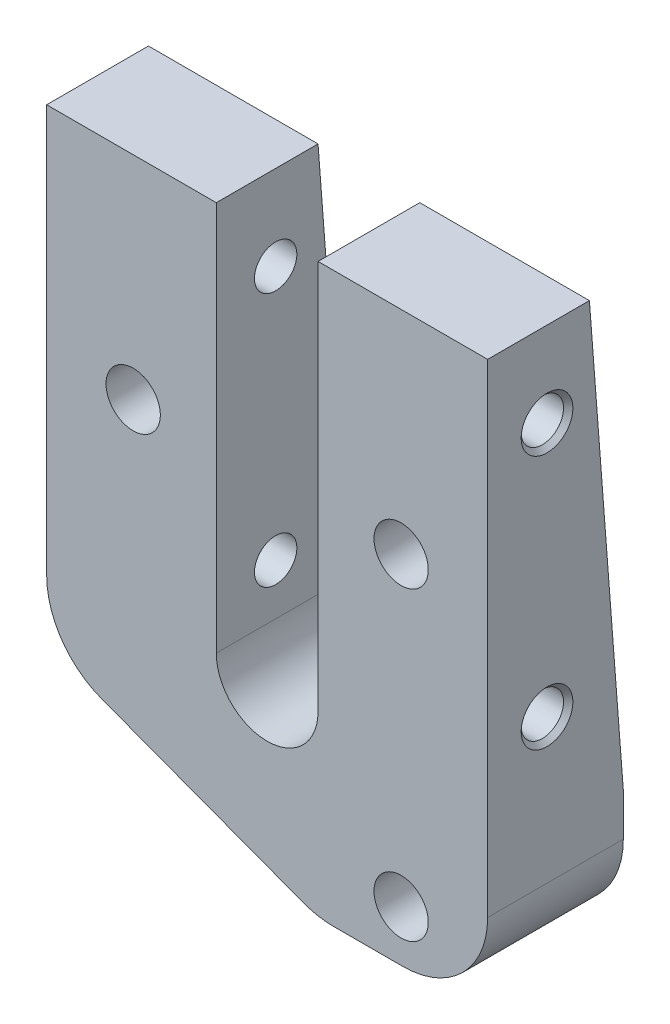
ISO-10303-21;
HEADER;
FILE_DESCRIPTION(('STEP AP214'),'2;1');
FILE_NAME('part.step','',(''),(''),'','','');
FILE_SCHEMA(('AUTOMOTIVE_DESIGN { 1 0 10303 214 1 1 1 1 }'));
ENDSEC;
DATA;
#1=APPLICATION_CONTEXT('core data for automotive mechanical design processes');
#2=APPLICATION_PROTOCOL_DEFINITION('international standard','automotive_design',2000,#1);
#3=PRODUCT_CONTEXT('',#1,'mechanical');
#4=PRODUCT('Part','Part','',(#3));
#5=PRODUCT_RELATED_PRODUCT_CATEGORY('part','',(#4));
#6=PRODUCT_DEFINITION_FORMATION('','',#4);
#7=PRODUCT_DEFINITION_CONTEXT('part definition',#1,'design');
#8=PRODUCT_DEFINITION('design','',#6,#7);
#9=PRODUCT_DEFINITION_SHAPE('','',#8);
#10=(LENGTH_UNIT() NAMED_UNIT(*) SI_UNIT(.MILLI.,.METRE.));
#11=(NAMED_UNIT(*) PLANE_ANGLE_UNIT() SI_UNIT($,.RADIAN.));
#12=(NAMED_UNIT(*) SI_UNIT($,.STERADIAN.) SOLID_ANGLE_UNIT());
#13=UNCERTAINTY_MEASURE_WITH_UNIT(LENGTH_MEASURE(1.E-05),#10,'distance_accuracy_value','');
#14=(GEOMETRIC_REPRESENTATION_CONTEXT(3) GLOBAL_UNCERTAINTY_ASSIGNED_CONTEXT((#13)) GLOBAL_UNIT_ASSIGNED_CONTEXT((#10,
#11,#12)) REPRESENTATION_CONTEXT('',''));
#15=CARTESIAN_POINT('',(0.,0.,0.));
#16=DIRECTION('',(0.,0.,1.));
#17=DIRECTION('',(1.,0.,0.));
#18=AXIS2_PLACEMENT_3D('',#15,#16,#17);
#19=CARTESIAN_POINT('',(0.,3.,-7.76923076923077));
#20=DIRECTION('',(0.,0.,1.));
#21=DIRECTION('',(-1.,0.,0.));
#22=AXIS2_PLACEMENT_3D('',#19,#20,#21);
#23=CYLINDRICAL_SURFACE('',#22,3.);
#24=CARTESIAN_POINT('',(0.,3.,-7.76923076923077));
#25=DIRECTION('',(0.,-0.0766964988847371,0.997054485501582));
#26=DIRECTION('',(0.,0.997054485501582,0.0766964988847371));
#27=AXIS2_PLACEMENT_3D('',#24,#25,#26);
#28=ELLIPSE('',#27,3.00886264855507,3.);
#29=CARTESIAN_POINT('',(3.,3.,-7.76923076923077));
#30=VERTEX_POINT('',#29);
#31=CARTESIAN_POINT('',(0.,0.,-8.));
#32=VERTEX_POINT('',#31);
#33=EDGE_CURVE('E218',#30,#32,#28,.F.);
#34=ORIENTED_EDGE('',*,*,#33,.T.);
#35=CARTESIAN_POINT('',(0.,3.,-7.76923076923077));
#36=DIRECTION('',(0.,-0.0766964988847371,0.997054485501582));
#37=DIRECTION('',(0.,0.997054485501582,0.0766964988847371));
#38=AXIS2_PLACEMENT_3D('',#35,#36,#37);
#39=ELLIPSE('',#38,3.00886264855507,3.);
#40=CARTESIAN_POINT('',(-3.,3.,-7.76923076923077));
#41=VERTEX_POINT('',#40);
#42=EDGE_CURVE('E221',#41,#32,#39,.T.);
#43=ORIENTED_EDGE('',*,*,#42,.F.);
#44=DIRECTION('',(0.,0.,-1.));
#45=VECTOR('',#44,1.);
#46=CARTESIAN_POINT('',(-3.,3.,-7.76923076923077));
#47=LINE('',#46,#45);
#48=CARTESIAN_POINT('',(-3.,3.00000000000001,0.));
#49=VERTEX_POINT('',#48);
#50=EDGE_CURVE('E155',#41,#49,#47,.F.);
#51=ORIENTED_EDGE('',*,*,#50,.T.);
#52=CARTESIAN_POINT('',(0.,3.,0.));
#53=DIRECTION('',(0.,0.,-1.));
#54=DIRECTION('',(-1.,0.,0.));
#55=AXIS2_PLACEMENT_3D('',#52,#53,#54);
#56=CIRCLE('',#55,3.);
#57=CARTESIAN_POINT('',(3.,3.00000000000001,0.));
#58=VERTEX_POINT('',#57);
#59=EDGE_CURVE('E224',#58,#49,#56,.T.);
#60=ORIENTED_EDGE('',*,*,#59,.F.);
#61=DIRECTION('',(0.,0.,-1.));
#62=VECTOR('',#61,1.);
#63=CARTESIAN_POINT('',(3.,3.,-7.76923076923077));
#64=LINE('',#63,#62);
#65=EDGE_CURVE('E215',#58,#30,#64,.T.);
#66=ORIENTED_EDGE('',*,*,#65,.T.);
#67=EDGE_LOOP('',(#34,#43,#51,#60,#66));
#68=FACE_BOUND('',#67,.T.);
#69=ADVANCED_FACE('F35',(#68),#23,.F.);
#70=CARTESIAN_POINT('',(13.,26.,-8.));
#71=DIRECTION('',(-1.,0.,0.));
#72=DIRECTION('',(0.,-1.,0.));
#73=AXIS2_PLACEMENT_3D('',#70,#71,#72);
#74=PLANE('',#73);
#75=CARTESIAN_POINT('',(13.,21.,-3.5));
#76=DIRECTION('',(-1.,0.,0.));
#77=DIRECTION('',(0.,0.,1.));
#78=AXIS2_PLACEMENT_3D('',#75,#76,#77);
#79=CIRCLE('',#78,1.525);
#80=CARTESIAN_POINT('',(13.,21.,-1.975));
#81=VERTEX_POINT('',#80);
#82=EDGE_CURVE('E366',#81,#81,#79,.T.);
#83=ORIENTED_EDGE('',*,*,#82,.T.);
#84=EDGE_LOOP('',(#83));
#85=FACE_BOUND('',#84,.T.);
#86=CARTESIAN_POINT('',(13.,6.,-3.5));
#87=DIRECTION('',(-1.,0.,0.));
#88=DIRECTION('',(0.,0.,1.));
#89=AXIS2_PLACEMENT_3D('',#86,#87,#88);
#90=CIRCLE('',#89,1.525);
#91=CARTESIAN_POINT('',(13.,6.,-1.975));
#92=VERTEX_POINT('',#91);
#93=EDGE_CURVE('E376',#92,#92,#90,.T.);
#94=ORIENTED_EDGE('',*,*,#93,.T.);
#95=EDGE_LOOP('',(#94));
#96=FACE_BOUND('',#95,.T.);
#97=DIRECTION('',(0.,1.,0.));
#98=VECTOR('',#97,1.);
#99=CARTESIAN_POINT('',(13.,26.,-8.));
#100=LINE('',#99,#98);
#101=CARTESIAN_POINT('',(13.,-2.5,-8.));
#102=VERTEX_POINT('',#101);
#103=CARTESIAN_POINT('',(13.,0.,-8.));
#104=VERTEX_POINT('',#103);
#105=EDGE_CURVE('E160',#102,#104,#100,.T.);
#106=ORIENTED_EDGE('',*,*,#105,.T.);
#107=DIRECTION('',(0.,-0.997054485501581,-0.076696498884737));
#108=VECTOR('',#107,1.);
#109=CARTESIAN_POINT('',(13.,26.,-6.));
#110=LINE('',#109,#108);
#111=CARTESIAN_POINT('',(13.,26.,-6.));
#112=VERTEX_POINT('',#111);
#113=EDGE_CURVE('E137',#112,#104,#110,.T.);
#114=ORIENTED_EDGE('',*,*,#113,.F.);
#115=DIRECTION('',(0.,0.,1.));
#116=VECTOR('',#115,1.);
#117=CARTESIAN_POINT('',(13.,26.,-8.));
#118=LINE('',#117,#116);
#119=CARTESIAN_POINT('',(13.,26.,0.));
#120=VERTEX_POINT('',#119);
#121=EDGE_CURVE('E148',#112,#120,#118,.T.);
#122=ORIENTED_EDGE('',*,*,#121,.T.);
#123=DIRECTION('',(0.,1.,0.));
#124=VECTOR('',#123,1.);
#125=CARTESIAN_POINT('',(13.,26.,0.));
#126=LINE('',#125,#124);
#127=CARTESIAN_POINT('',(13.,-2.5,0.));
#128=VERTEX_POINT('',#127);
#129=EDGE_CURVE('E191',#128,#120,#126,.T.);
#130=ORIENTED_EDGE('',*,*,#129,.F.);
#131=DIRECTION('',(0.,0.,1.));
#132=VECTOR('',#131,1.);
#133=CARTESIAN_POINT('',(13.,-2.5,-8.));
#134=LINE('',#133,#132);
#135=EDGE_CURVE('E250',#102,#128,#134,.T.);
#136=ORIENTED_EDGE('',*,*,#135,.F.);
#137=EDGE_LOOP('',(#106,#114,#122,#130,#136));
#138=FACE_BOUND('',#137,.T.);
#139=ADVANCED_FACE('F158',(#85,#96,#138),#74,.F.);
#140=CARTESIAN_POINT('',(3.,26.,-8.));
#141=DIRECTION('',(0.,-1.,0.));
#142=DIRECTION('',(1.,0.,0.));
#143=AXIS2_PLACEMENT_3D('',#140,#141,#142);
#144=PLANE('',#143);
#145=DIRECTION('',(1.,0.,0.));
#146=VECTOR('',#145,1.);
#147=CARTESIAN_POINT('',(-13.,26.,-6.));
#148=LINE('',#147,#146);
#149=CARTESIAN_POINT('',(3.,26.,-6.));
#150=VERTEX_POINT('',#149);
#151=EDGE_CURVE('E133',#150,#112,#148,.T.);
#152=ORIENTED_EDGE('',*,*,#151,.F.);
#153=DIRECTION('',(0.,0.,1.));
#154=VECTOR('',#153,1.);
#155=CARTESIAN_POINT('',(3.,26.,-8.));
#156=LINE('',#155,#154);
#157=CARTESIAN_POINT('',(3.,26.,0.));
#158=VERTEX_POINT('',#157);
#159=EDGE_CURVE('E156',#150,#158,#156,.T.);
#160=ORIENTED_EDGE('',*,*,#159,.T.);
#161=DIRECTION('',(-1.,0.,0.));
#162=VECTOR('',#161,1.);
#163=CARTESIAN_POINT('',(3.,26.,0.));
#164=LINE('',#163,#162);
#165=EDGE_CURVE('E151',#120,#158,#164,.T.);
#166=ORIENTED_EDGE('',*,*,#165,.F.);
#167=ORIENTED_EDGE('',*,*,#121,.F.);
#168=EDGE_LOOP('',(#152,#160,#166,#167));
#169=FACE_BOUND('',#168,.T.);
#170=ADVANCED_FACE('F149',(#169),#144,.F.);
#171=CARTESIAN_POINT('',(3.,0.,-8.));
#172=DIRECTION('',(1.,0.,0.));
#173=DIRECTION('',(0.,0.,1.));
#174=AXIS2_PLACEMENT_3D('',#171,#172,#173);
#175=PLANE('',#174);
#176=CARTESIAN_POINT('',(3.,21.,-3.5));
#177=DIRECTION('',(-1.,0.,0.));
#178=DIRECTION('',(0.,0.,1.));
#179=AXIS2_PLACEMENT_3D('',#176,#177,#178);
#180=CIRCLE('',#179,1.25);
#181=CARTESIAN_POINT('',(3.,21.,-2.25));
#182=VERTEX_POINT('',#181);
#183=EDGE_CURVE('E373',#182,#182,#180,.T.);
#184=ORIENTED_EDGE('',*,*,#183,.F.);
#185=EDGE_LOOP('',(#184));
#186=FACE_BOUND('',#185,.T.);
#187=CARTESIAN_POINT('',(3.,6.,-3.5));
#188=DIRECTION('',(-1.,0.,0.));
#189=DIRECTION('',(0.,0.,1.));
#190=AXIS2_PLACEMENT_3D('',#187,#188,#189);
#191=CIRCLE('',#190,1.25);
#192=CARTESIAN_POINT('',(3.,6.,-2.25));
#193=VERTEX_POINT('',#192);
#194=EDGE_CURVE('E385',#193,#193,#191,.T.);
#195=ORIENTED_EDGE('',*,*,#194,.F.);
#196=EDGE_LOOP('',(#195));
#197=FACE_BOUND('',#196,.T.);
#198=DIRECTION('',(0.,-1.,0.));
#199=VECTOR('',#198,1.);
#200=CARTESIAN_POINT('',(3.,0.,0.));
#201=LINE('',#200,#199);
#202=EDGE_CURVE('E194',#158,#58,#201,.T.);
#203=ORIENTED_EDGE('',*,*,#202,.F.);
#204=ORIENTED_EDGE('',*,*,#159,.F.);
#205=DIRECTION('',(0.,-0.997054485501582,-0.0766964988847371));
#206=VECTOR('',#205,1.);
#207=CARTESIAN_POINT('',(3.,0.,-8.));
#208=LINE('',#207,#206);
#209=EDGE_CURVE('E140',#150,#30,#208,.T.);
#210=ORIENTED_EDGE('',*,*,#209,.T.);
#211=ORIENTED_EDGE('',*,*,#65,.F.);
#212=EDGE_LOOP('',(#203,#204,#210,#211));
#213=FACE_BOUND('',#212,.T.);
#214=ADVANCED_FACE('F311',(#186,#197,#213),#175,.F.);
#215=CARTESIAN_POINT('',(-3.00000000000001,26.,-8.));
#216=DIRECTION('',(-1.,0.,0.));
#217=DIRECTION('',(0.,-1.,0.));
#218=AXIS2_PLACEMENT_3D('',#215,#216,#217);
#219=PLANE('',#218);
#220=CARTESIAN_POINT('',(-3.00000000000001,21.,-3.5));
#221=DIRECTION('',(1.,0.,0.));
#222=DIRECTION('',(0.,-1.,0.));
#223=AXIS2_PLACEMENT_3D('',#220,#221,#222);
#224=CIRCLE('',#223,1.25);
#225=CARTESIAN_POINT('',(-3.00000000000001,19.75,-3.5));
#226=VERTEX_POINT('',#225);
#227=EDGE_CURVE('E39',#226,#226,#224,.T.);
#228=ORIENTED_EDGE('',*,*,#227,.F.);
#229=EDGE_LOOP('',(#228));
#230=FACE_BOUND('',#229,.T.);
#231=CARTESIAN_POINT('',(-3.,6.,-3.5));
#232=DIRECTION('',(1.,0.,0.));
#233=DIRECTION('',(0.,-1.,0.));
#234=AXIS2_PLACEMENT_3D('',#231,#232,#233);
#235=CIRCLE('',#234,1.25);
#236=CARTESIAN_POINT('',(-3.,4.75,-3.5));
#237=VERTEX_POINT('',#236);
#238=EDGE_CURVE('E388',#237,#237,#235,.T.);
#239=ORIENTED_EDGE('',*,*,#238,.F.);
#240=EDGE_LOOP('',(#239));
#241=FACE_BOUND('',#240,.T.);
#242=DIRECTION('',(0.,0.997054485501582,0.0766964988847371));
#243=VECTOR('',#242,1.);
#244=CARTESIAN_POINT('',(-3.00000000000001,25.8470588235294,-6.01176470588235));
#245=LINE('',#244,#243);
#246=CARTESIAN_POINT('',(-3.00000000000001,26.,-6.));
#247=VERTEX_POINT('',#246);
#248=EDGE_CURVE('E172',#41,#247,#245,.T.);
#249=ORIENTED_EDGE('',*,*,#248,.T.);
#250=DIRECTION('',(0.,0.,1.));
#251=VECTOR('',#250,1.);
#252=CARTESIAN_POINT('',(-3.00000000000001,26.,-8.));
#253=LINE('',#252,#251);
#254=CARTESIAN_POINT('',(-3.00000000000001,26.,0.));
#255=VERTEX_POINT('',#254);
#256=EDGE_CURVE('E209',#247,#255,#253,.T.);
#257=ORIENTED_EDGE('',*,*,#256,.T.);
#258=DIRECTION('',(0.,1.,0.));
#259=VECTOR('',#258,1.);
#260=CARTESIAN_POINT('',(-3.00000000000001,26.,0.));
#261=LINE('',#260,#259);
#262=EDGE_CURVE('E196',#49,#255,#261,.T.);
#263=ORIENTED_EDGE('',*,*,#262,.F.);
#264=ORIENTED_EDGE('',*,*,#50,.F.);
#265=EDGE_LOOP('',(#249,#257,#263,#264));
#266=FACE_BOUND('',#265,.T.);
#267=ADVANCED_FACE('F264',(#230,#241,#266),#219,.F.);
#268=CARTESIAN_POINT('',(-13.,26.,-8.));
#269=DIRECTION('',(0.,-1.,0.));
#270=DIRECTION('',(1.,0.,0.));
#271=AXIS2_PLACEMENT_3D('',#268,#269,#270);
#272=PLANE('',#271);
#273=CARTESIAN_POINT('',(-13.,26.,-6.));
#274=VERTEX_POINT('',#273);
#275=EDGE_CURVE('E144',#274,#247,#148,.T.);
#276=ORIENTED_EDGE('',*,*,#275,.F.);
#277=DIRECTION('',(0.,0.,1.));
#278=VECTOR('',#277,1.);
#279=CARTESIAN_POINT('',(-13.,26.,-8.));
#280=LINE('',#279,#278);
#281=CARTESIAN_POINT('',(-13.,26.,0.));
#282=VERTEX_POINT('',#281);
#283=EDGE_CURVE('E188',#274,#282,#280,.T.);
#284=ORIENTED_EDGE('',*,*,#283,.T.);
#285=DIRECTION('',(-1.,0.,0.));
#286=VECTOR('',#285,1.);
#287=CARTESIAN_POINT('',(-13.,26.,0.));
#288=LINE('',#287,#286);
#289=EDGE_CURVE('E199',#255,#282,#288,.T.);
#290=ORIENTED_EDGE('',*,*,#289,.F.);
#291=ORIENTED_EDGE('',*,*,#256,.F.);
#292=EDGE_LOOP('',(#276,#284,#290,#291));
#293=FACE_BOUND('',#292,.T.);
#294=ADVANCED_FACE('F262',(#293),#272,.F.);
#295=CARTESIAN_POINT('',(-13.,-1.5,-8.));
#296=DIRECTION('',(1.,0.,0.));
#297=DIRECTION('',(0.,1.,0.));
#298=AXIS2_PLACEMENT_3D('',#295,#296,#297);
#299=PLANE('',#298);
#300=CARTESIAN_POINT('',(-13.,21.,-3.5));
#301=DIRECTION('',(-1.,0.,0.));
#302=DIRECTION('',(0.,0.,1.));
#303=AXIS2_PLACEMENT_3D('',#300,#301,#302);
#304=CIRCLE('',#303,1.24999999999999);
#305=CARTESIAN_POINT('',(-13.,21.,-2.25000000000001));
#306=VERTEX_POINT('',#305);
#307=EDGE_CURVE('E368',#306,#306,#304,.T.);
#308=ORIENTED_EDGE('',*,*,#307,.F.);
#309=EDGE_LOOP('',(#308));
#310=FACE_BOUND('',#309,.T.);
#311=CARTESIAN_POINT('',(-13.,6.,-3.5));
#312=DIRECTION('',(-1.,0.,0.));
#313=DIRECTION('',(0.,0.,1.));
#314=AXIS2_PLACEMENT_3D('',#311,#312,#313);
#315=CIRCLE('',#314,1.24999999999999);
#316=CARTESIAN_POINT('',(-13.,6.,-2.25));
#317=VERTEX_POINT('',#316);
#318=EDGE_CURVE('E382',#317,#317,#315,.T.);
#319=ORIENTED_EDGE('',*,*,#318,.F.);
#320=EDGE_LOOP('',(#319));
#321=FACE_BOUND('',#320,.T.);
#322=DIRECTION('',(0.,-1.,0.));
#323=VECTOR('',#322,1.);
#324=CARTESIAN_POINT('',(-13.,-1.5,0.));
#325=LINE('',#324,#323);
#326=CARTESIAN_POINT('',(-13.,1.96500234082346,0.));
#327=VERTEX_POINT('',#326);
#328=EDGE_CURVE('E202',#282,#327,#325,.T.);
#329=ORIENTED_EDGE('',*,*,#328,.F.);
#330=ORIENTED_EDGE('',*,*,#283,.F.);
#331=DIRECTION('',(0.,-0.997054485501581,-0.076696498884737));
#332=VECTOR('',#331,1.);
#333=CARTESIAN_POINT('',(-13.,26.,-6.));
#334=LINE('',#333,#332);
#335=CARTESIAN_POINT('',(-13.,1.96500234082346,-7.84884597378281));
#336=VERTEX_POINT('',#335);
#337=EDGE_CURVE('E145',#274,#336,#334,.T.);
#338=ORIENTED_EDGE('',*,*,#337,.T.);
#339=DIRECTION('',(0.,0.,1.));
#340=VECTOR('',#339,1.);
#341=CARTESIAN_POINT('',(-13.,1.96500234082346,-8.));
#342=LINE('',#341,#340);
#343=EDGE_CURVE('E44',#327,#336,#342,.F.);
#344=ORIENTED_EDGE('',*,*,#343,.F.);
#345=EDGE_LOOP('',(#329,#330,#338,#344));
#346=FACE_BOUND('',#345,.T.);
#347=ADVANCED_FACE('F256',(#310,#321,#346),#299,.F.);
#348=CARTESIAN_POINT('',(0.,0.,-8.));
#349=DIRECTION('',(0.,0.,1.));
#350=DIRECTION('',(-1.,0.,0.));
#351=AXIS2_PLACEMENT_3D('',#348,#349,#350);
#352=PLANE('',#351);
#353=CARTESIAN_POINT('',(7.9,-4.5,-8.));
#354=DIRECTION('',(0.,0.,-1.));
#355=DIRECTION('',(-1.,0.,0.));
#356=AXIS2_PLACEMENT_3D('',#353,#354,#355);
#357=CIRCLE('',#356,1.6);
#358=CARTESIAN_POINT('',(6.30000000000001,-4.5,-8.));
#359=VERTEX_POINT('',#358);
#360=EDGE_CURVE('E161',#359,#359,#357,.T.);
#361=ORIENTED_EDGE('',*,*,#360,.F.);
#362=EDGE_LOOP('',(#361));
#363=FACE_BOUND('',#362,.T.);
#364=DIRECTION('',(0.936329177569045,-0.351123441588391,0.));
#365=VECTOR('',#364,1.);
#366=CARTESIAN_POINT('',(-13.,-1.5,-8.));
#367=LINE('',#366,#365);
#368=CARTESIAN_POINT('',(-9.75561720794196,-2.71664354702177,-8.));
#369=VERTEX_POINT('',#368);
#370=CARTESIAN_POINT('',(2.1510557009206,-7.18164588784522,-8.));
#371=VERTEX_POINT('',#370);
#372=EDGE_CURVE('E185',#369,#371,#367,.T.);
#373=ORIENTED_EDGE('',*,*,#372,.F.);
#374=CARTESIAN_POINT('',(-8.,1.96500234082346,-8.));
#375=DIRECTION('',(0.,0.,-1.));
#376=DIRECTION('',(-1.,0.,0.));
#377=AXIS2_PLACEMENT_3D('',#374,#375,#376);
#378=CIRCLE('',#377,5.);
#379=CARTESIAN_POINT('',(-12.5976913555129,0.,-8.));
#380=VERTEX_POINT('',#379);
#381=EDGE_CURVE('E243',#380,#369,#378,.F.);
#382=ORIENTED_EDGE('',*,*,#381,.F.);
#383=DIRECTION('',(1.,0.,0.));
#384=VECTOR('',#383,1.);
#385=CARTESIAN_POINT('',(-13.,0.,-8.));
#386=LINE('',#385,#384);
#387=EDGE_CURVE('E170',#380,#32,#386,.T.);
#388=ORIENTED_EDGE('',*,*,#387,.T.);
#389=DIRECTION('',(-1.,0.,0.));
#390=VECTOR('',#389,1.);
#391=CARTESIAN_POINT('',(-3.,0.,-8.));
#392=LINE('',#391,#390);
#393=EDGE_CURVE('E183',#104,#32,#392,.T.);
#394=ORIENTED_EDGE('',*,*,#393,.F.);
#395=ORIENTED_EDGE('',*,*,#105,.F.);
#396=CARTESIAN_POINT('',(8.,-2.5,-8.));
#397=DIRECTION('',(0.,0.,-1.));
#398=DIRECTION('',(-1.,0.,0.));
#399=AXIS2_PLACEMENT_3D('',#396,#397,#398);
#400=CIRCLE('',#399,5.);
#401=CARTESIAN_POINT('',(8.,-7.5,-8.));
#402=VERTEX_POINT('',#401);
#403=EDGE_CURVE('E57',#402,#102,#400,.F.);
#404=ORIENTED_EDGE('',*,*,#403,.F.);
#405=DIRECTION('',(1.,0.,0.));
#406=VECTOR('',#405,1.);
#407=CARTESIAN_POINT('',(3.,-7.5,-8.));
#408=LINE('',#407,#406);
#409=CARTESIAN_POINT('',(3.90667290886256,-7.5,-8.));
#410=VERTEX_POINT('',#409);
#411=EDGE_CURVE('E178',#410,#402,#408,.T.);
#412=ORIENTED_EDGE('',*,*,#411,.F.);
#413=CARTESIAN_POINT('',(3.90667290886256,-2.5,-8.));
#414=DIRECTION('',(0.,0.,-1.));
#415=DIRECTION('',(-1.,0.,0.));
#416=AXIS2_PLACEMENT_3D('',#413,#414,#415);
#417=CIRCLE('',#416,5.);
#418=EDGE_CURVE('E247',#371,#410,#417,.F.);
#419=ORIENTED_EDGE('',*,*,#418,.F.);
#420=EDGE_LOOP('',(#373,#382,#388,#394,#395,#404,#412,#419));
#421=FACE_BOUND('',#420,.T.);
#422=ADVANCED_FACE('F271',(#363,#421),#352,.F.);
#423=CARTESIAN_POINT('',(3.,-7.5,-8.));
#424=DIRECTION('',(0.,1.,0.));
#425=DIRECTION('',(0.,0.,-1.));
#426=AXIS2_PLACEMENT_3D('',#423,#424,#425);
#427=PLANE('',#426);
#428=ORIENTED_EDGE('',*,*,#411,.T.);
#429=DIRECTION('',(0.,0.,1.));
#430=VECTOR('',#429,1.);
#431=CARTESIAN_POINT('',(8.,-7.5,-8.));
#432=LINE('',#431,#430);
#433=CARTESIAN_POINT('',(8.,-7.5,0.));
#434=VERTEX_POINT('',#433);
#435=EDGE_CURVE('E227',#434,#402,#432,.F.);
#436=ORIENTED_EDGE('',*,*,#435,.F.);
#437=DIRECTION('',(1.,0.,0.));
#438=VECTOR('',#437,1.);
#439=CARTESIAN_POINT('',(3.,-7.5,0.));
#440=LINE('',#439,#438);
#441=CARTESIAN_POINT('',(3.90667290886256,-7.5,0.));
#442=VERTEX_POINT('',#441);
#443=EDGE_CURVE('E177',#442,#434,#440,.T.);
#444=ORIENTED_EDGE('',*,*,#443,.F.);
#445=DIRECTION('',(0.,0.,1.));
#446=VECTOR('',#445,1.);
#447=CARTESIAN_POINT('',(3.90667290886256,-7.5,-8.));
#448=LINE('',#447,#446);
#449=EDGE_CURVE('E229',#410,#442,#448,.T.);
#450=ORIENTED_EDGE('',*,*,#449,.F.);
#451=EDGE_LOOP('',(#428,#436,#444,#450));
#452=FACE_BOUND('',#451,.T.);
#453=ADVANCED_FACE('F284',(#452),#427,.F.);
#454=CARTESIAN_POINT('',(-13.,-1.5,-8.));
#455=DIRECTION('',(0.351123441588391,0.936329177569045,0.));
#456=DIRECTION('',(-0.936329177569045,0.351123441588391,0.));
#457=AXIS2_PLACEMENT_3D('',#454,#455,#456);
#458=PLANE('',#457);
#459=DIRECTION('',(0.936329177569045,-0.351123441588391,0.));
#460=VECTOR('',#459,1.);
#461=CARTESIAN_POINT('',(-13.,-1.5,0.));
#462=LINE('',#461,#460);
#463=CARTESIAN_POINT('',(-9.75561720794196,-2.71664354702177,0.));
#464=VERTEX_POINT('',#463);
#465=CARTESIAN_POINT('',(2.1510557009206,-7.18164588784522,0.));
#466=VERTEX_POINT('',#465);
#467=EDGE_CURVE('E181',#464,#466,#462,.T.);
#468=ORIENTED_EDGE('',*,*,#467,.F.);
#469=DIRECTION('',(0.,0.,1.));
#470=VECTOR('',#469,1.);
#471=CARTESIAN_POINT('',(-9.75561720794196,-2.71664354702177,-8.));
#472=LINE('',#471,#470);
#473=EDGE_CURVE('E238',#369,#464,#472,.T.);
#474=ORIENTED_EDGE('',*,*,#473,.F.);
#475=ORIENTED_EDGE('',*,*,#372,.T.);
#476=DIRECTION('',(0.,0.,1.));
#477=VECTOR('',#476,1.);
#478=CARTESIAN_POINT('',(2.1510557009206,-7.18164588784522,-8.));
#479=LINE('',#478,#477);
#480=EDGE_CURVE('E241',#466,#371,#479,.F.);
#481=ORIENTED_EDGE('',*,*,#480,.F.);
#482=EDGE_LOOP('',(#468,#474,#475,#481));
#483=FACE_BOUND('',#482,.T.);
#484=ADVANCED_FACE('F276',(#483),#458,.F.);
#485=CARTESIAN_POINT('',(0.,0.,0.));
#486=DIRECTION('',(0.,0.,1.));
#487=DIRECTION('',(-1.,0.,0.));
#488=AXIS2_PLACEMENT_3D('',#485,#486,#487);
#489=PLANE('',#488);
#490=CARTESIAN_POINT('',(7.9,13.5,0.));
#491=DIRECTION('',(0.,0.,-1.));
#492=DIRECTION('',(-1.,0.,0.));
#493=AXIS2_PLACEMENT_3D('',#490,#491,#492);
#494=CIRCLE('',#493,1.59999999999999);
#495=CARTESIAN_POINT('',(6.30000000000002,13.5,0.));
#496=VERTEX_POINT('',#495);
#497=EDGE_CURVE('E391',#496,#496,#494,.T.);
#498=ORIENTED_EDGE('',*,*,#497,.T.);
#499=EDGE_LOOP('',(#498));
#500=FACE_BOUND('',#499,.T.);
#501=CARTESIAN_POINT('',(-7.9,13.5,0.));
#502=DIRECTION('',(0.,0.,-1.));
#503=DIRECTION('',(-1.,0.,0.));
#504=AXIS2_PLACEMENT_3D('',#501,#502,#503);
#505=CIRCLE('',#504,1.59999999999999);
#506=CARTESIAN_POINT('',(-9.49999999999999,13.5,0.));
#507=VERTEX_POINT('',#506);
#508=EDGE_CURVE('E397',#507,#507,#505,.T.);
#509=ORIENTED_EDGE('',*,*,#508,.T.);
#510=EDGE_LOOP('',(#509));
#511=FACE_BOUND('',#510,.T.);
#512=CARTESIAN_POINT('',(7.9,-4.5,0.));
#513=DIRECTION('',(0.,0.,-1.));
#514=DIRECTION('',(-1.,0.,0.));
#515=AXIS2_PLACEMENT_3D('',#512,#513,#514);
#516=CIRCLE('',#515,1.59999999999999);
#517=CARTESIAN_POINT('',(6.30000000000002,-4.5,0.));
#518=VERTEX_POINT('',#517);
#519=EDGE_CURVE('E166',#518,#518,#516,.T.);
#520=ORIENTED_EDGE('',*,*,#519,.T.);
#521=EDGE_LOOP('',(#520));
#522=FACE_BOUND('',#521,.T.);
#523=ORIENTED_EDGE('',*,*,#443,.T.);
#524=CARTESIAN_POINT('',(8.,-2.5,0.));
#525=DIRECTION('',(0.,0.,-1.));
#526=DIRECTION('',(-1.,0.,0.));
#527=AXIS2_PLACEMENT_3D('',#524,#525,#526);
#528=CIRCLE('',#527,5.);
#529=EDGE_CURVE('E234',#128,#434,#528,.T.);
#530=ORIENTED_EDGE('',*,*,#529,.F.);
#531=ORIENTED_EDGE('',*,*,#129,.T.);
#532=ORIENTED_EDGE('',*,*,#165,.T.);
#533=ORIENTED_EDGE('',*,*,#202,.T.);
#534=ORIENTED_EDGE('',*,*,#59,.T.);
#535=ORIENTED_EDGE('',*,*,#262,.T.);
#536=ORIENTED_EDGE('',*,*,#289,.T.);
#537=ORIENTED_EDGE('',*,*,#328,.T.);
#538=CARTESIAN_POINT('',(-8.,1.96500234082346,0.));
#539=DIRECTION('',(0.,0.,-1.));
#540=DIRECTION('',(-1.,0.,0.));
#541=AXIS2_PLACEMENT_3D('',#538,#539,#540);
#542=CIRCLE('',#541,5.);
#543=EDGE_CURVE('E232',#464,#327,#542,.T.);
#544=ORIENTED_EDGE('',*,*,#543,.F.);
#545=ORIENTED_EDGE('',*,*,#467,.T.);
#546=CARTESIAN_POINT('',(3.90667290886256,-2.5,0.));
#547=DIRECTION('',(0.,0.,-1.));
#548=DIRECTION('',(-1.,0.,0.));
#549=AXIS2_PLACEMENT_3D('',#546,#547,#548);
#550=CIRCLE('',#549,5.);
#551=EDGE_CURVE('E236',#442,#466,#550,.T.);
#552=ORIENTED_EDGE('',*,*,#551,.F.);
#553=EDGE_LOOP('',(#523,#530,#531,#532,#533,#534,#535,#536,#537,#544,#545,#552));
#554=FACE_BOUND('',#553,.T.);
#555=ADVANCED_FACE('F278',(#500,#511,#522,#554),#489,.T.);
#556=CARTESIAN_POINT('',(-13.,26.,-6.));
#557=DIRECTION('',(0.,0.0766964988847371,-0.997054485501582));
#558=DIRECTION('',(0.,-0.997054485501582,-0.0766964988847371));
#559=AXIS2_PLACEMENT_3D('',#556,#557,#558);
#560=PLANE('',#559);
#561=CARTESIAN_POINT('',(7.9,13.5,-6.96153846153846));
#562=DIRECTION('',(0.,-0.0766964988847371,0.997054485501582));
#563=DIRECTION('',(0.,0.997054485501582,0.0766964988847371));
#564=AXIS2_PLACEMENT_3D('',#561,#562,#563);
#565=ELLIPSE('',#564,1.60472674589603,1.59999999999999);
#566=CARTESIAN_POINT('',(7.9,15.1,-6.83846153846154));
#567=VERTEX_POINT('',#566);
#568=EDGE_CURVE('E394',#567,#567,#565,.T.);
#569=ORIENTED_EDGE('',*,*,#568,.T.);
#570=EDGE_LOOP('',(#569));
#571=FACE_BOUND('',#570,.T.);
#572=ORIENTED_EDGE('',*,*,#209,.F.);
#573=ORIENTED_EDGE('',*,*,#151,.T.);
#574=ORIENTED_EDGE('',*,*,#113,.T.);
#575=ORIENTED_EDGE('',*,*,#393,.T.);
#576=ORIENTED_EDGE('',*,*,#33,.F.);
#577=EDGE_LOOP('',(#572,#573,#574,#575,#576));
#578=FACE_BOUND('',#577,.T.);
#579=ADVANCED_FACE('F135',(#571,#578),#560,.T.);
#580=CARTESIAN_POINT('',(-7.9,13.5,-6.96153846153846));
#581=DIRECTION('',(0.,-0.0766964988847371,0.997054485501582));
#582=DIRECTION('',(0.,0.997054485501582,0.0766964988847371));
#583=AXIS2_PLACEMENT_3D('',#580,#581,#582);
#584=ELLIPSE('',#583,1.60472674589603,1.59999999999999);
#585=CARTESIAN_POINT('',(-7.9,15.1,-6.83846153846154));
#586=VERTEX_POINT('',#585);
#587=EDGE_CURVE('E400',#586,#586,#584,.T.);
#588=ORIENTED_EDGE('',*,*,#587,.T.);
#589=EDGE_LOOP('',(#588));
#590=FACE_BOUND('',#589,.T.);
#591=ORIENTED_EDGE('',*,*,#337,.F.);
#592=ORIENTED_EDGE('',*,*,#275,.T.);
#593=ORIENTED_EDGE('',*,*,#248,.F.);
#594=ORIENTED_EDGE('',*,*,#42,.T.);
#595=ORIENTED_EDGE('',*,*,#387,.F.);
#596=CARTESIAN_POINT('',(-8.,1.96500234082346,-7.84884597378281));
#597=DIRECTION('',(0.,-0.0766964988847371,0.997054485501582));
#598=DIRECTION('',(0.,0.997054485501582,0.0766964988847371));
#599=AXIS2_PLACEMENT_3D('',#596,#597,#598);
#600=ELLIPSE('',#599,5.01477108092511,5.);
#601=EDGE_CURVE('E11',#336,#380,#600,.T.);
#602=ORIENTED_EDGE('',*,*,#601,.F.);
#603=EDGE_LOOP('',(#591,#592,#593,#594,#595,#602));
#604=FACE_BOUND('',#603,.T.);
#605=ADVANCED_FACE('F258',(#590,#604),#560,.T.);
#606=CARTESIAN_POINT('',(7.9,-4.5,0.));
#607=DIRECTION('',(0.,0.,1.));
#608=DIRECTION('',(-1.,0.,0.));
#609=AXIS2_PLACEMENT_3D('',#606,#607,#608);
#610=CYLINDRICAL_SURFACE('',#609,1.59999999999999);
#611=ORIENTED_EDGE('',*,*,#360,.T.);
#612=EDGE_LOOP('',(#611));
#613=FACE_BOUND('',#612,.T.);
#614=ORIENTED_EDGE('',*,*,#519,.F.);
#615=EDGE_LOOP('',(#614));
#616=FACE_BOUND('',#615,.T.);
#617=ADVANCED_FACE('F334',(#613,#616),#610,.F.);
#618=CARTESIAN_POINT('',(-7.9,13.5,0.));
#619=DIRECTION('',(0.,0.,1.));
#620=DIRECTION('',(-1.,0.,0.));
#621=AXIS2_PLACEMENT_3D('',#618,#619,#620);
#622=CYLINDRICAL_SURFACE('',#621,1.59999999999999);
#623=ORIENTED_EDGE('',*,*,#587,.F.);
#624=EDGE_LOOP('',(#623));
#625=FACE_BOUND('',#624,.T.);
#626=ORIENTED_EDGE('',*,*,#508,.F.);
#627=EDGE_LOOP('',(#626));
#628=FACE_BOUND('',#627,.T.);
#629=ADVANCED_FACE('F296',(#625,#628),#622,.F.);
#630=CARTESIAN_POINT('',(7.9,13.5,0.));
#631=DIRECTION('',(0.,0.,1.));
#632=DIRECTION('',(-1.,0.,0.));
#633=AXIS2_PLACEMENT_3D('',#630,#631,#632);
#634=CYLINDRICAL_SURFACE('',#633,1.59999999999999);
#635=ORIENTED_EDGE('',*,*,#568,.F.);
#636=EDGE_LOOP('',(#635));
#637=FACE_BOUND('',#636,.T.);
#638=ORIENTED_EDGE('',*,*,#497,.F.);
#639=EDGE_LOOP('',(#638));
#640=FACE_BOUND('',#639,.T.);
#641=ADVANCED_FACE('F290',(#637,#640),#634,.F.);
#642=CARTESIAN_POINT('',(3.90667290886256,-2.5,-8.));
#643=DIRECTION('',(0.,0.,1.));
#644=DIRECTION('',(-1.,0.,0.));
#645=AXIS2_PLACEMENT_3D('',#642,#643,#644);
#646=CYLINDRICAL_SURFACE('',#645,5.);
#647=ORIENTED_EDGE('',*,*,#418,.T.);
#648=ORIENTED_EDGE('',*,*,#449,.T.);
#649=ORIENTED_EDGE('',*,*,#551,.T.);
#650=ORIENTED_EDGE('',*,*,#480,.T.);
#651=EDGE_LOOP('',(#647,#648,#649,#650));
#652=FACE_BOUND('',#651,.T.);
#653=ADVANCED_FACE('F287',(#652),#646,.T.);
#654=CARTESIAN_POINT('',(8.,-2.5,-8.));
#655=DIRECTION('',(0.,0.,1.));
#656=DIRECTION('',(-1.,0.,0.));
#657=AXIS2_PLACEMENT_3D('',#654,#655,#656);
#658=CYLINDRICAL_SURFACE('',#657,5.);
#659=ORIENTED_EDGE('',*,*,#403,.T.);
#660=ORIENTED_EDGE('',*,*,#135,.T.);
#661=ORIENTED_EDGE('',*,*,#529,.T.);
#662=ORIENTED_EDGE('',*,*,#435,.T.);
#663=EDGE_LOOP('',(#659,#660,#661,#662));
#664=FACE_BOUND('',#663,.T.);
#665=ADVANCED_FACE('F289',(#664),#658,.T.);
#666=CARTESIAN_POINT('',(-8.,1.96500234082346,-8.));
#667=DIRECTION('',(0.,0.,1.));
#668=DIRECTION('',(-1.,0.,0.));
#669=AXIS2_PLACEMENT_3D('',#666,#667,#668);
#670=CYLINDRICAL_SURFACE('',#669,5.);
#671=ORIENTED_EDGE('',*,*,#601,.T.);
#672=ORIENTED_EDGE('',*,*,#381,.T.);
#673=ORIENTED_EDGE('',*,*,#473,.T.);
#674=ORIENTED_EDGE('',*,*,#543,.T.);
#675=ORIENTED_EDGE('',*,*,#343,.T.);
#676=EDGE_LOOP('',(#671,#672,#673,#674,#675));
#677=FACE_BOUND('',#676,.T.);
#678=ADVANCED_FACE('F37',(#677),#670,.T.);
#679=CARTESIAN_POINT('',(13.,6.,-3.5));
#680=DIRECTION('',(1.,0.,0.));
#681=DIRECTION('',(0.,0.,1.));
#682=AXIS2_PLACEMENT_3D('',#679,#680,#681);
#683=CYLINDRICAL_SURFACE('',#682,1.25);
#684=ORIENTED_EDGE('',*,*,#318,.T.);
#685=EDGE_LOOP('',(#684));
#686=FACE_BOUND('',#685,.T.);
#687=ORIENTED_EDGE('',*,*,#238,.T.);
#688=EDGE_LOOP('',(#687));
#689=FACE_BOUND('',#688,.T.);
#690=ADVANCED_FACE('F341',(#686,#689),#683,.F.);
#691=CARTESIAN_POINT('',(12.725,6.,-3.5));
#692=DIRECTION('',(-1.,0.,0.));
#693=DIRECTION('',(0.,0.,1.));
#694=AXIS2_PLACEMENT_3D('',#691,#692,#693);
#695=CIRCLE('',#694,1.25);
#696=CARTESIAN_POINT('',(12.725,6.,-2.25));
#697=VERTEX_POINT('',#696);
#698=EDGE_CURVE('E379',#697,#697,#695,.T.);
#699=ORIENTED_EDGE('',*,*,#698,.F.);
#700=EDGE_LOOP('',(#699));
#701=FACE_BOUND('',#700,.T.);
#702=ORIENTED_EDGE('',*,*,#194,.T.);
#703=EDGE_LOOP('',(#702));
#704=FACE_BOUND('',#703,.T.);
#705=ADVANCED_FACE('F344',(#701,#704),#683,.F.);
#706=CARTESIAN_POINT('',(13.,6.,-3.5));
#707=DIRECTION('',(1.,0.,0.));
#708=DIRECTION('',(0.,0.,1.));
#709=AXIS2_PLACEMENT_3D('',#706,#707,#708);
#710=CONICAL_SURFACE('',#709,1.525,0.785398163397459);
#711=ORIENTED_EDGE('',*,*,#698,.T.);
#712=EDGE_LOOP('',(#711));
#713=FACE_BOUND('',#712,.T.);
#714=ORIENTED_EDGE('',*,*,#93,.F.);
#715=EDGE_LOOP('',(#714));
#716=FACE_BOUND('',#715,.T.);
#717=ADVANCED_FACE('F346',(#713,#716),#710,.F.);
#718=CARTESIAN_POINT('',(13.,21.,-3.5));
#719=DIRECTION('',(1.,0.,0.));
#720=DIRECTION('',(0.,0.,1.));
#721=AXIS2_PLACEMENT_3D('',#718,#719,#720);
#722=CYLINDRICAL_SURFACE('',#721,1.25);
#723=ORIENTED_EDGE('',*,*,#307,.T.);
#724=EDGE_LOOP('',(#723));
#725=FACE_BOUND('',#724,.T.);
#726=ORIENTED_EDGE('',*,*,#227,.T.);
#727=EDGE_LOOP('',(#726));
#728=FACE_BOUND('',#727,.T.);
#729=ADVANCED_FACE('F349',(#725,#728),#722,.F.);
#730=CARTESIAN_POINT('',(12.725,21.,-3.5));
#731=DIRECTION('',(-1.,0.,0.));
#732=DIRECTION('',(0.,0.,1.));
#733=AXIS2_PLACEMENT_3D('',#730,#731,#732);
#734=CIRCLE('',#733,1.25);
#735=CARTESIAN_POINT('',(12.725,21.,-2.25));
#736=VERTEX_POINT('',#735);
#737=EDGE_CURVE('E363',#736,#736,#734,.T.);
#738=ORIENTED_EDGE('',*,*,#737,.F.);
#739=EDGE_LOOP('',(#738));
#740=FACE_BOUND('',#739,.T.);
#741=ORIENTED_EDGE('',*,*,#183,.T.);
#742=EDGE_LOOP('',(#741));
#743=FACE_BOUND('',#742,.T.);
#744=ADVANCED_FACE('F351',(#740,#743),#722,.F.);
#745=CARTESIAN_POINT('',(13.,21.,-3.5));
#746=DIRECTION('',(1.,0.,0.));
#747=DIRECTION('',(0.,0.,1.));
#748=AXIS2_PLACEMENT_3D('',#745,#746,#747);
#749=CONICAL_SURFACE('',#748,1.525,0.785398163397455);
#750=ORIENTED_EDGE('',*,*,#737,.T.);
#751=EDGE_LOOP('',(#750));
#752=FACE_BOUND('',#751,.T.);
#753=ORIENTED_EDGE('',*,*,#82,.F.);
#754=EDGE_LOOP('',(#753));
#755=FACE_BOUND('',#754,.T.);
#756=ADVANCED_FACE('F354',(#752,#755),#749,.F.);
#757=CLOSED_SHELL('',(#69,#139,#170,#214,#267,#294,#347,#422,#453,#484,#555,#579,#605,#617,#629,
#641,#653,#665,#678,#690,#705,#717,#729,#744,#756));
#758=MANIFOLD_SOLID_BREP('B2',#757);
#759=ADVANCED_BREP_SHAPE_REPRESENTATION('',(#18,#758),#14);
#760=SHAPE_DEFINITION_REPRESENTATION(#9,#759);
ENDSEC;
END-ISO-10303-21;
